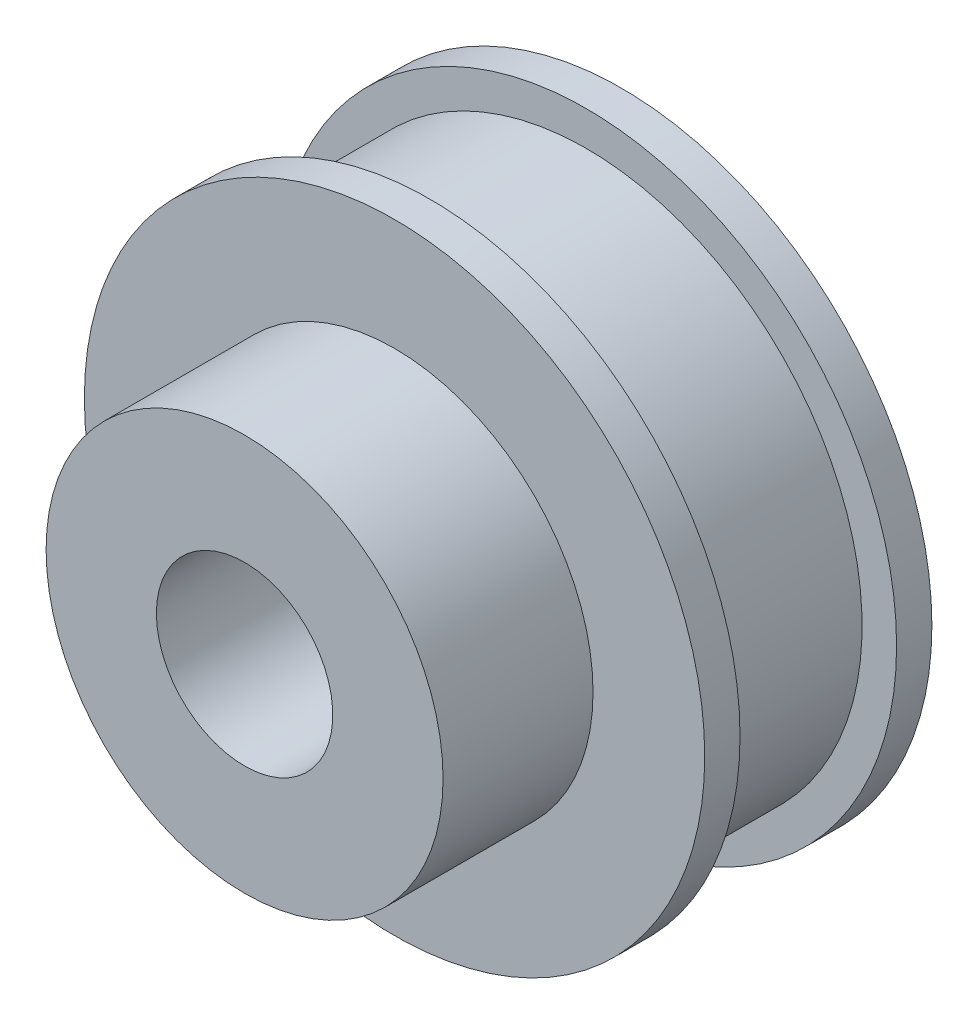
ISO-10303-21;
HEADER;
FILE_DESCRIPTION(('STEP AP214'),'2;1');
FILE_NAME('part.step','',(''),(''),'','','');
FILE_SCHEMA(('AUTOMOTIVE_DESIGN { 1 0 10303 214 1 1 1 1 }'));
ENDSEC;
DATA;
#1=APPLICATION_CONTEXT('core data for automotive mechanical design processes');
#2=APPLICATION_PROTOCOL_DEFINITION('international standard','automotive_design',2000,#1);
#3=PRODUCT_CONTEXT('',#1,'mechanical');
#4=PRODUCT('Part','Part','',(#3));
#5=PRODUCT_RELATED_PRODUCT_CATEGORY('part','',(#4));
#6=PRODUCT_DEFINITION_FORMATION('','',#4);
#7=PRODUCT_DEFINITION_CONTEXT('part definition',#1,'design');
#8=PRODUCT_DEFINITION('design','',#6,#7);
#9=PRODUCT_DEFINITION_SHAPE('','',#8);
#10=(LENGTH_UNIT() NAMED_UNIT(*) SI_UNIT(.MILLI.,.METRE.));
#11=(NAMED_UNIT(*) PLANE_ANGLE_UNIT() SI_UNIT($,.RADIAN.));
#12=(NAMED_UNIT(*) SI_UNIT($,.STERADIAN.) SOLID_ANGLE_UNIT());
#13=UNCERTAINTY_MEASURE_WITH_UNIT(LENGTH_MEASURE(1.E-05),#10,'distance_accuracy_value','');
#14=(GEOMETRIC_REPRESENTATION_CONTEXT(3) GLOBAL_UNCERTAINTY_ASSIGNED_CONTEXT((#13)) GLOBAL_UNIT_ASSIGNED_CONTEXT((#10,
#11,#12)) REPRESENTATION_CONTEXT('',''));
#15=CARTESIAN_POINT('',(0.,0.,0.));
#16=DIRECTION('',(0.,0.,1.));
#17=DIRECTION('',(1.,0.,0.));
#18=AXIS2_PLACEMENT_3D('',#15,#16,#17);
#19=CARTESIAN_POINT('',(4.,0.,-0.8));
#20=DIRECTION('',(0.,0.,1.));
#21=DIRECTION('',(1.,0.,0.));
#22=AXIS2_PLACEMENT_3D('',#19,#20,#21);
#23=PLANE('',#22);
#24=CARTESIAN_POINT('',(0.,0.,-0.8));
#25=DIRECTION('',(0.,0.,-1.));
#26=DIRECTION('',(-1.,0.,0.));
#27=AXIS2_PLACEMENT_3D('',#24,#25,#26);
#28=CIRCLE('',#27,4.);
#29=CARTESIAN_POINT('',(-4.,0.,-0.8));
#30=VERTEX_POINT('',#29);
#31=EDGE_CURVE('E10',#30,#30,#28,.T.);
#32=ORIENTED_EDGE('',*,*,#31,.F.);
#33=EDGE_LOOP('',(#32));
#34=FACE_BOUND('',#33,.T.);
#35=CARTESIAN_POINT('',(0.,0.,-0.8));
#36=DIRECTION('',(0.,0.,-1.));
#37=DIRECTION('',(-1.,0.,0.));
#38=AXIS2_PLACEMENT_3D('',#35,#36,#37);
#39=CIRCLE('',#38,14.065);
#40=CARTESIAN_POINT('',(-14.065,0.,-0.8));
#41=VERTEX_POINT('',#40);
#42=EDGE_CURVE('E72',#41,#41,#39,.T.);
#43=ORIENTED_EDGE('',*,*,#42,.T.);
#44=EDGE_LOOP('',(#43));
#45=FACE_BOUND('',#44,.T.);
#46=ADVANCED_FACE('F40',(#34,#45),#23,.F.);
#47=CARTESIAN_POINT('',(0.,0.,0.));
#48=DIRECTION('',(0.,0.,-1.));
#49=DIRECTION('',(-1.,0.,0.));
#50=AXIS2_PLACEMENT_3D('',#47,#48,#49);
#51=CYLINDRICAL_SURFACE('',#50,4.);
#52=CARTESIAN_POINT('',(0.,0.,16.3));
#53=DIRECTION('',(0.,0.,-1.));
#54=DIRECTION('',(-1.,0.,0.));
#55=AXIS2_PLACEMENT_3D('',#52,#53,#54);
#56=CIRCLE('',#55,4.);
#57=CARTESIAN_POINT('',(-4.,0.,16.3));
#58=VERTEX_POINT('',#57);
#59=EDGE_CURVE('E43',#58,#58,#56,.T.);
#60=ORIENTED_EDGE('',*,*,#59,.F.);
#61=EDGE_LOOP('',(#60));
#62=FACE_BOUND('',#61,.T.);
#63=ORIENTED_EDGE('',*,*,#31,.T.);
#64=EDGE_LOOP('',(#63));
#65=FACE_BOUND('',#64,.T.);
#66=ADVANCED_FACE('F118',(#62,#65),#51,.F.);
#67=CARTESIAN_POINT('',(9.,0.,16.3));
#68=DIRECTION('',(0.,0.,-1.));
#69=DIRECTION('',(-1.,0.,0.));
#70=AXIS2_PLACEMENT_3D('',#67,#68,#69);
#71=PLANE('',#70);
#72=CARTESIAN_POINT('',(0.,0.,16.3));
#73=DIRECTION('',(0.,0.,-1.));
#74=DIRECTION('',(-1.,0.,0.));
#75=AXIS2_PLACEMENT_3D('',#72,#73,#74);
#76=CIRCLE('',#75,9.);
#77=CARTESIAN_POINT('',(-9.,0.,16.3));
#78=VERTEX_POINT('',#77);
#79=EDGE_CURVE('E50',#78,#78,#76,.T.);
#80=ORIENTED_EDGE('',*,*,#79,.F.);
#81=EDGE_LOOP('',(#80));
#82=FACE_BOUND('',#81,.T.);
#83=ORIENTED_EDGE('',*,*,#59,.T.);
#84=EDGE_LOOP('',(#83));
#85=FACE_BOUND('',#84,.T.);
#86=ADVANCED_FACE('F113',(#82,#85),#71,.F.);
#87=CARTESIAN_POINT('',(0.,0.,0.));
#88=DIRECTION('',(0.,0.,-1.));
#89=DIRECTION('',(-1.,0.,0.));
#90=AXIS2_PLACEMENT_3D('',#87,#88,#89);
#91=CYLINDRICAL_SURFACE('',#90,9.);
#92=CARTESIAN_POINT('',(0.,0.,9.5));
#93=DIRECTION('',(0.,0.,-1.));
#94=DIRECTION('',(-1.,0.,0.));
#95=AXIS2_PLACEMENT_3D('',#92,#93,#94);
#96=CIRCLE('',#95,9.);
#97=CARTESIAN_POINT('',(-9.,0.,9.5));
#98=VERTEX_POINT('',#97);
#99=EDGE_CURVE('E51',#98,#98,#96,.T.);
#100=ORIENTED_EDGE('',*,*,#99,.F.);
#101=EDGE_LOOP('',(#100));
#102=FACE_BOUND('',#101,.T.);
#103=ORIENTED_EDGE('',*,*,#79,.T.);
#104=EDGE_LOOP('',(#103));
#105=FACE_BOUND('',#104,.T.);
#106=ADVANCED_FACE('F108',(#102,#105),#91,.T.);
#107=CARTESIAN_POINT('',(14.065,0.,9.5));
#108=DIRECTION('',(0.,0.,-1.));
#109=DIRECTION('',(-1.,0.,0.));
#110=AXIS2_PLACEMENT_3D('',#107,#108,#109);
#111=PLANE('',#110);
#112=CARTESIAN_POINT('',(0.,0.,9.5));
#113=DIRECTION('',(0.,0.,-1.));
#114=DIRECTION('',(-1.,0.,0.));
#115=AXIS2_PLACEMENT_3D('',#112,#113,#114);
#116=CIRCLE('',#115,14.065);
#117=CARTESIAN_POINT('',(-14.065,0.,9.5));
#118=VERTEX_POINT('',#117);
#119=EDGE_CURVE('E57',#118,#118,#116,.T.);
#120=ORIENTED_EDGE('',*,*,#119,.F.);
#121=EDGE_LOOP('',(#120));
#122=FACE_BOUND('',#121,.T.);
#123=ORIENTED_EDGE('',*,*,#99,.T.);
#124=EDGE_LOOP('',(#123));
#125=FACE_BOUND('',#124,.T.);
#126=ADVANCED_FACE('F103',(#122,#125),#111,.F.);
#127=CARTESIAN_POINT('',(0.,0.,0.));
#128=DIRECTION('',(0.,0.,-1.));
#129=DIRECTION('',(-1.,0.,0.));
#130=AXIS2_PLACEMENT_3D('',#127,#128,#129);
#131=CYLINDRICAL_SURFACE('',#130,14.065);
#132=CARTESIAN_POINT('',(0.,0.,7.9));
#133=DIRECTION('',(0.,0.,-1.));
#134=DIRECTION('',(-1.,0.,0.));
#135=AXIS2_PLACEMENT_3D('',#132,#133,#134);
#136=CIRCLE('',#135,14.065);
#137=CARTESIAN_POINT('',(-14.065,0.,7.9));
#138=VERTEX_POINT('',#137);
#139=EDGE_CURVE('E56',#138,#138,#136,.T.);
#140=ORIENTED_EDGE('',*,*,#139,.F.);
#141=EDGE_LOOP('',(#140));
#142=FACE_BOUND('',#141,.T.);
#143=ORIENTED_EDGE('',*,*,#119,.T.);
#144=EDGE_LOOP('',(#143));
#145=FACE_BOUND('',#144,.T.);
#146=ADVANCED_FACE('F100',(#142,#145),#131,.T.);
#147=CARTESIAN_POINT('',(12.5,0.,7.9));
#148=DIRECTION('',(0.,0.,1.));
#149=DIRECTION('',(1.,0.,0.));
#150=AXIS2_PLACEMENT_3D('',#147,#148,#149);
#151=PLANE('',#150);
#152=CARTESIAN_POINT('',(0.,0.,7.9));
#153=DIRECTION('',(0.,0.,-1.));
#154=DIRECTION('',(-1.,0.,0.));
#155=AXIS2_PLACEMENT_3D('',#152,#153,#154);
#156=CIRCLE('',#155,12.5);
#157=CARTESIAN_POINT('',(-12.5,0.,7.9));
#158=VERTEX_POINT('',#157);
#159=EDGE_CURVE('E65',#158,#158,#156,.T.);
#160=ORIENTED_EDGE('',*,*,#159,.F.);
#161=EDGE_LOOP('',(#160));
#162=FACE_BOUND('',#161,.T.);
#163=ORIENTED_EDGE('',*,*,#139,.T.);
#164=EDGE_LOOP('',(#163));
#165=FACE_BOUND('',#164,.T.);
#166=ADVANCED_FACE('F93',(#162,#165),#151,.F.);
#167=CARTESIAN_POINT('',(0.,0.,0.));
#168=DIRECTION('',(0.,0.,-1.));
#169=DIRECTION('',(-1.,0.,0.));
#170=AXIS2_PLACEMENT_3D('',#167,#168,#169);
#171=CYLINDRICAL_SURFACE('',#170,12.5);
#172=CARTESIAN_POINT('',(0.,0.,0.800000000000001));
#173=DIRECTION('',(0.,0.,-1.));
#174=DIRECTION('',(-1.,0.,0.));
#175=AXIS2_PLACEMENT_3D('',#172,#173,#174);
#176=CIRCLE('',#175,12.5);
#177=CARTESIAN_POINT('',(-12.5,0.,0.800000000000001));
#178=VERTEX_POINT('',#177);
#179=EDGE_CURVE('E63',#178,#178,#176,.T.);
#180=ORIENTED_EDGE('',*,*,#179,.F.);
#181=EDGE_LOOP('',(#180));
#182=FACE_BOUND('',#181,.T.);
#183=ORIENTED_EDGE('',*,*,#159,.T.);
#184=EDGE_LOOP('',(#183));
#185=FACE_BOUND('',#184,.T.);
#186=ADVANCED_FACE('F84',(#182,#185),#171,.T.);
#187=CARTESIAN_POINT('',(14.065,0.,0.800000000000001));
#188=DIRECTION('',(0.,0.,-1.));
#189=DIRECTION('',(-1.,0.,0.));
#190=AXIS2_PLACEMENT_3D('',#187,#188,#189);
#191=PLANE('',#190);
#192=CARTESIAN_POINT('',(0.,0.,0.8));
#193=DIRECTION('',(0.,0.,-1.));
#194=DIRECTION('',(-1.,0.,0.));
#195=AXIS2_PLACEMENT_3D('',#192,#193,#194);
#196=CIRCLE('',#195,14.065);
#197=CARTESIAN_POINT('',(-14.065,0.,0.8));
#198=VERTEX_POINT('',#197);
#199=EDGE_CURVE('E66',#198,#198,#196,.T.);
#200=ORIENTED_EDGE('',*,*,#199,.F.);
#201=EDGE_LOOP('',(#200));
#202=FACE_BOUND('',#201,.T.);
#203=ORIENTED_EDGE('',*,*,#179,.T.);
#204=EDGE_LOOP('',(#203));
#205=FACE_BOUND('',#204,.T.);
#206=ADVANCED_FACE('F76',(#202,#205),#191,.F.);
#207=CARTESIAN_POINT('',(0.,0.,0.));
#208=DIRECTION('',(0.,0.,-1.));
#209=DIRECTION('',(-1.,0.,0.));
#210=AXIS2_PLACEMENT_3D('',#207,#208,#209);
#211=CYLINDRICAL_SURFACE('',#210,14.065);
#212=ORIENTED_EDGE('',*,*,#42,.F.);
#213=EDGE_LOOP('',(#212));
#214=FACE_BOUND('',#213,.T.);
#215=ORIENTED_EDGE('',*,*,#199,.T.);
#216=EDGE_LOOP('',(#215));
#217=FACE_BOUND('',#216,.T.);
#218=ADVANCED_FACE('F77',(#214,#217),#211,.T.);
#219=CLOSED_SHELL('',(#46,#66,#86,#106,#126,#146,#166,#186,#206,#218));
#220=MANIFOLD_SOLID_BREP('B2',#219);
#221=ADVANCED_BREP_SHAPE_REPRESENTATION('',(#18,#220),#14);
#222=SHAPE_DEFINITION_REPRESENTATION(#9,#221);
ENDSEC;
END-ISO-10303-21;
